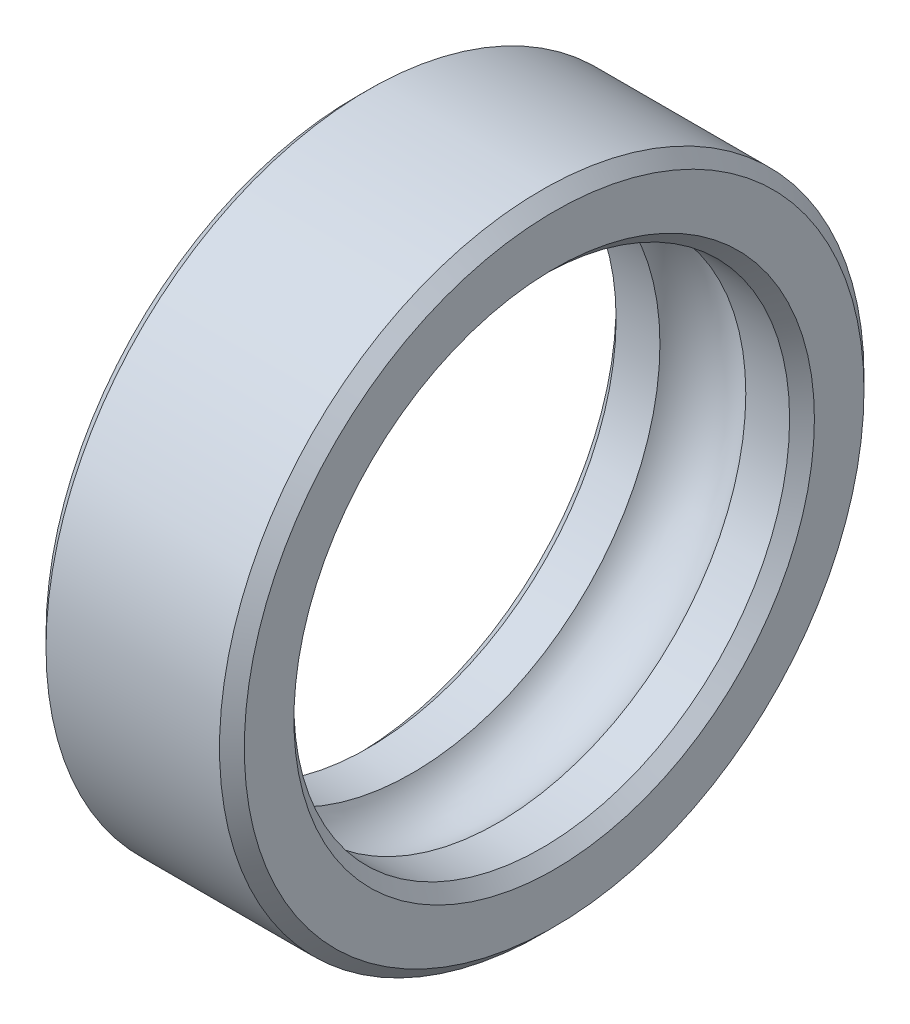
ISO-10303-21;
HEADER;
FILE_DESCRIPTION(('STEP AP214'),'2;1');
FILE_NAME('part.step','',(''),(''),'','','');
FILE_SCHEMA(('AUTOMOTIVE_DESIGN { 1 0 10303 214 1 1 1 1 }'));
ENDSEC;
DATA;
#1=APPLICATION_CONTEXT('core data for automotive mechanical design processes');
#2=APPLICATION_PROTOCOL_DEFINITION('international standard','automotive_design',2000,#1);
#3=PRODUCT_CONTEXT('',#1,'mechanical');
#4=PRODUCT('Part','Part','',(#3));
#5=PRODUCT_RELATED_PRODUCT_CATEGORY('part','',(#4));
#6=PRODUCT_DEFINITION_FORMATION('','',#4);
#7=PRODUCT_DEFINITION_CONTEXT('part definition',#1,'design');
#8=PRODUCT_DEFINITION('design','',#6,#7);
#9=PRODUCT_DEFINITION_SHAPE('','',#8);
#10=(LENGTH_UNIT() NAMED_UNIT(*) SI_UNIT(.MILLI.,.METRE.));
#11=(NAMED_UNIT(*) PLANE_ANGLE_UNIT() SI_UNIT($,.RADIAN.));
#12=(NAMED_UNIT(*) SI_UNIT($,.STERADIAN.) SOLID_ANGLE_UNIT());
#13=UNCERTAINTY_MEASURE_WITH_UNIT(LENGTH_MEASURE(1.E-05),#10,'distance_accuracy_value','');
#14=(GEOMETRIC_REPRESENTATION_CONTEXT(3) GLOBAL_UNCERTAINTY_ASSIGNED_CONTEXT((#13)) GLOBAL_UNIT_ASSIGNED_CONTEXT((#10,
#11,#12)) REPRESENTATION_CONTEXT('',''));
#15=CARTESIAN_POINT('',(0.,0.,0.));
#16=DIRECTION('',(0.,0.,1.));
#17=DIRECTION('',(1.,0.,0.));
#18=AXIS2_PLACEMENT_3D('',#15,#16,#17);
#19=CARTESIAN_POINT('',(0.,0.,0.));
#20=DIRECTION('',(1.,0.,0.));
#21=DIRECTION('',(0.,0.,-1.));
#22=AXIS2_PLACEMENT_3D('',#19,#20,#21);
#23=CYLINDRICAL_SURFACE('',#22,10.);
#24=CARTESIAN_POINT('',(-0.500000000000007,0.,0.));
#25=DIRECTION('',(1.,0.,0.));
#26=DIRECTION('',(0.,0.,-1.));
#27=AXIS2_PLACEMENT_3D('',#24,#25,#26);
#28=CIRCLE('',#27,10.);
#29=CARTESIAN_POINT('',(-0.500000000000007,0.,-10.));
#30=VERTEX_POINT('',#29);
#31=EDGE_CURVE('E64',#30,#30,#28,.T.);
#32=ORIENTED_EDGE('',*,*,#31,.T.);
#33=EDGE_LOOP('',(#32));
#34=FACE_BOUND('',#33,.T.);
#35=CARTESIAN_POINT('',(-2.26794919243112,0.,0.));
#36=DIRECTION('',(1.,0.,0.));
#37=DIRECTION('',(0.,0.,-1.));
#38=AXIS2_PLACEMENT_3D('',#35,#36,#37);
#39=CIRCLE('',#38,10.);
#40=CARTESIAN_POINT('',(-2.26794919243112,0.,-10.));
#41=VERTEX_POINT('',#40);
#42=EDGE_CURVE('E80',#41,#41,#39,.T.);
#43=ORIENTED_EDGE('',*,*,#42,.F.);
#44=EDGE_LOOP('',(#43));
#45=FACE_BOUND('',#44,.T.);
#46=ADVANCED_FACE('F39',(#34,#45),#23,.F.);
#47=CARTESIAN_POINT('',(-4.,0.,0.));
#48=DIRECTION('',(1.,0.,0.));
#49=DIRECTION('',(0.,0.,-1.));
#50=AXIS2_PLACEMENT_3D('',#47,#48,#49);
#51=TOROIDAL_SURFACE('',#50,9.,2.);
#52=ORIENTED_EDGE('',*,*,#42,.T.);
#53=EDGE_LOOP('',(#52));
#54=FACE_BOUND('',#53,.T.);
#55=CARTESIAN_POINT('',(-5.73205080756888,0.,0.));
#56=DIRECTION('',(1.,0.,0.));
#57=DIRECTION('',(0.,0.,-1.));
#58=AXIS2_PLACEMENT_3D('',#55,#56,#57);
#59=CIRCLE('',#58,10.);
#60=CARTESIAN_POINT('',(-5.73205080756888,0.,-10.));
#61=VERTEX_POINT('',#60);
#62=EDGE_CURVE('E84',#61,#61,#59,.T.);
#63=ORIENTED_EDGE('',*,*,#62,.F.);
#64=EDGE_LOOP('',(#63));
#65=FACE_BOUND('',#64,.T.);
#66=ADVANCED_FACE('F91',(#54,#65),#51,.F.);
#67=CARTESIAN_POINT('',(0.,0.,0.));
#68=DIRECTION('',(1.,0.,0.));
#69=DIRECTION('',(0.,0.,-1.));
#70=AXIS2_PLACEMENT_3D('',#67,#68,#69);
#71=CYLINDRICAL_SURFACE('',#70,10.);
#72=CARTESIAN_POINT('',(-7.5,0.,0.));
#73=DIRECTION('',(-1.,0.,0.));
#74=DIRECTION('',(0.,0.,1.));
#75=AXIS2_PLACEMENT_3D('',#72,#73,#74);
#76=CIRCLE('',#75,10.);
#77=CARTESIAN_POINT('',(-7.5,0.,10.));
#78=VERTEX_POINT('',#77);
#79=EDGE_CURVE('E68',#78,#78,#76,.T.);
#80=ORIENTED_EDGE('',*,*,#79,.T.);
#81=EDGE_LOOP('',(#80));
#82=FACE_BOUND('',#81,.T.);
#83=ORIENTED_EDGE('',*,*,#62,.T.);
#84=EDGE_LOOP('',(#83));
#85=FACE_BOUND('',#84,.T.);
#86=ADVANCED_FACE('F89',(#82,#85),#71,.F.);
#87=CARTESIAN_POINT('',(-8.,13.,0.));
#88=DIRECTION('',(-1.,0.,0.));
#89=DIRECTION('',(0.,0.,1.));
#90=AXIS2_PLACEMENT_3D('',#87,#88,#89);
#91=PLANE('',#90);
#92=CARTESIAN_POINT('',(-8.,0.,0.));
#93=DIRECTION('',(-1.,0.,0.));
#94=DIRECTION('',(0.,0.,1.));
#95=AXIS2_PLACEMENT_3D('',#92,#93,#94);
#96=CIRCLE('',#95,10.5);
#97=CARTESIAN_POINT('',(-8.,0.,10.5));
#98=VERTEX_POINT('',#97);
#99=EDGE_CURVE('E72',#98,#98,#96,.F.);
#100=ORIENTED_EDGE('',*,*,#99,.T.);
#101=EDGE_LOOP('',(#100));
#102=FACE_BOUND('',#101,.T.);
#103=CARTESIAN_POINT('',(-8.,0.,0.));
#104=DIRECTION('',(-1.,0.,0.));
#105=DIRECTION('',(0.,0.,1.));
#106=AXIS2_PLACEMENT_3D('',#103,#104,#105);
#107=CIRCLE('',#106,12.5);
#108=CARTESIAN_POINT('',(-8.,0.,12.5));
#109=VERTEX_POINT('',#108);
#110=EDGE_CURVE('E76',#109,#109,#107,.T.);
#111=ORIENTED_EDGE('',*,*,#110,.T.);
#112=EDGE_LOOP('',(#111));
#113=FACE_BOUND('',#112,.T.);
#114=ADVANCED_FACE('F99',(#102,#113),#91,.T.);
#115=CARTESIAN_POINT('',(0.,0.,0.));
#116=DIRECTION('',(1.,0.,0.));
#117=DIRECTION('',(0.,0.,-1.));
#118=AXIS2_PLACEMENT_3D('',#115,#116,#117);
#119=CYLINDRICAL_SURFACE('',#118,13.);
#120=CARTESIAN_POINT('',(-7.5,0.,0.));
#121=DIRECTION('',(-1.,0.,0.));
#122=DIRECTION('',(0.,0.,1.));
#123=AXIS2_PLACEMENT_3D('',#120,#121,#122);
#124=CIRCLE('',#123,13.);
#125=CARTESIAN_POINT('',(-7.5,0.,13.));
#126=VERTEX_POINT('',#125);
#127=EDGE_CURVE('E10',#126,#126,#124,.F.);
#128=ORIENTED_EDGE('',*,*,#127,.T.);
#129=EDGE_LOOP('',(#128));
#130=FACE_BOUND('',#129,.T.);
#131=CARTESIAN_POINT('',(-0.499999999999983,0.,0.));
#132=DIRECTION('',(1.,0.,0.));
#133=DIRECTION('',(0.,0.,-1.));
#134=AXIS2_PLACEMENT_3D('',#131,#132,#133);
#135=CIRCLE('',#134,13.);
#136=CARTESIAN_POINT('',(-0.499999999999983,0.,-13.));
#137=VERTEX_POINT('',#136);
#138=EDGE_CURVE('E48',#137,#137,#135,.F.);
#139=ORIENTED_EDGE('',*,*,#138,.T.);
#140=EDGE_LOOP('',(#139));
#141=FACE_BOUND('',#140,.T.);
#142=ADVANCED_FACE('F134',(#130,#141),#119,.T.);
#143=CARTESIAN_POINT('',(0.,10.,0.));
#144=DIRECTION('',(1.,0.,0.));
#145=DIRECTION('',(0.,0.,-1.));
#146=AXIS2_PLACEMENT_3D('',#143,#144,#145);
#147=PLANE('',#146);
#148=CARTESIAN_POINT('',(0.,0.,0.));
#149=DIRECTION('',(1.,0.,0.));
#150=DIRECTION('',(0.,0.,-1.));
#151=AXIS2_PLACEMENT_3D('',#148,#149,#150);
#152=CIRCLE('',#151,10.5);
#153=CARTESIAN_POINT('',(0.,0.,-10.5));
#154=VERTEX_POINT('',#153);
#155=EDGE_CURVE('E53',#154,#154,#152,.F.);
#156=ORIENTED_EDGE('',*,*,#155,.T.);
#157=EDGE_LOOP('',(#156));
#158=FACE_BOUND('',#157,.T.);
#159=CARTESIAN_POINT('',(0.,0.,0.));
#160=DIRECTION('',(1.,0.,0.));
#161=DIRECTION('',(0.,0.,-1.));
#162=AXIS2_PLACEMENT_3D('',#159,#160,#161);
#163=CIRCLE('',#162,12.5);
#164=CARTESIAN_POINT('',(0.,0.,-12.5));
#165=VERTEX_POINT('',#164);
#166=EDGE_CURVE('E58',#165,#165,#163,.T.);
#167=ORIENTED_EDGE('',*,*,#166,.T.);
#168=EDGE_LOOP('',(#167));
#169=FACE_BOUND('',#168,.T.);
#170=ADVANCED_FACE('F114',(#158,#169),#147,.T.);
#171=CARTESIAN_POINT('',(-8.,0.,0.));
#172=DIRECTION('',(-1.,0.,0.));
#173=DIRECTION('',(0.,0.,1.));
#174=AXIS2_PLACEMENT_3D('',#171,#172,#173);
#175=CONICAL_SURFACE('',#174,10.5,0.785398163397448);
#176=ORIENTED_EDGE('',*,*,#79,.F.);
#177=EDGE_LOOP('',(#176));
#178=FACE_BOUND('',#177,.T.);
#179=ORIENTED_EDGE('',*,*,#99,.F.);
#180=EDGE_LOOP('',(#179));
#181=FACE_BOUND('',#180,.T.);
#182=ADVANCED_FACE('F107',(#178,#181),#175,.F.);
#183=CARTESIAN_POINT('',(-0.500000000000007,0.,0.));
#184=DIRECTION('',(1.,0.,0.));
#185=DIRECTION('',(0.,0.,-1.));
#186=AXIS2_PLACEMENT_3D('',#183,#184,#185);
#187=CONICAL_SURFACE('',#186,10.,0.785398163397448);
#188=ORIENTED_EDGE('',*,*,#155,.F.);
#189=EDGE_LOOP('',(#188));
#190=FACE_BOUND('',#189,.T.);
#191=ORIENTED_EDGE('',*,*,#31,.F.);
#192=EDGE_LOOP('',(#191));
#193=FACE_BOUND('',#192,.T.);
#194=ADVANCED_FACE('F113',(#190,#193),#187,.F.);
#195=CARTESIAN_POINT('',(-7.5,0.,0.));
#196=DIRECTION('',(1.,0.,0.));
#197=DIRECTION('',(0.,0.,-1.));
#198=AXIS2_PLACEMENT_3D('',#195,#196,#197);
#199=CONICAL_SURFACE('',#198,13.,0.785398163397448);
#200=ORIENTED_EDGE('',*,*,#110,.F.);
#201=EDGE_LOOP('',(#200));
#202=FACE_BOUND('',#201,.T.);
#203=ORIENTED_EDGE('',*,*,#127,.F.);
#204=EDGE_LOOP('',(#203));
#205=FACE_BOUND('',#204,.T.);
#206=ADVANCED_FACE('F120',(#202,#205),#199,.T.);
#207=CARTESIAN_POINT('',(0.,0.,0.));
#208=DIRECTION('',(-1.,0.,0.));
#209=DIRECTION('',(0.,0.,1.));
#210=AXIS2_PLACEMENT_3D('',#207,#208,#209);
#211=CONICAL_SURFACE('',#210,12.5,0.78539816339745);
#212=ORIENTED_EDGE('',*,*,#138,.F.);
#213=EDGE_LOOP('',(#212));
#214=FACE_BOUND('',#213,.T.);
#215=ORIENTED_EDGE('',*,*,#166,.F.);
#216=EDGE_LOOP('',(#215));
#217=FACE_BOUND('',#216,.T.);
#218=ADVANCED_FACE('F42',(#214,#217),#211,.T.);
#219=CLOSED_SHELL('',(#46,#66,#86,#114,#142,#170,#182,#194,#206,#218));
#220=MANIFOLD_SOLID_BREP('B2',#219);
#221=ADVANCED_BREP_SHAPE_REPRESENTATION('',(#18,#220),#14);
#222=SHAPE_DEFINITION_REPRESENTATION(#9,#221);
ENDSEC;
END-ISO-10303-21;
